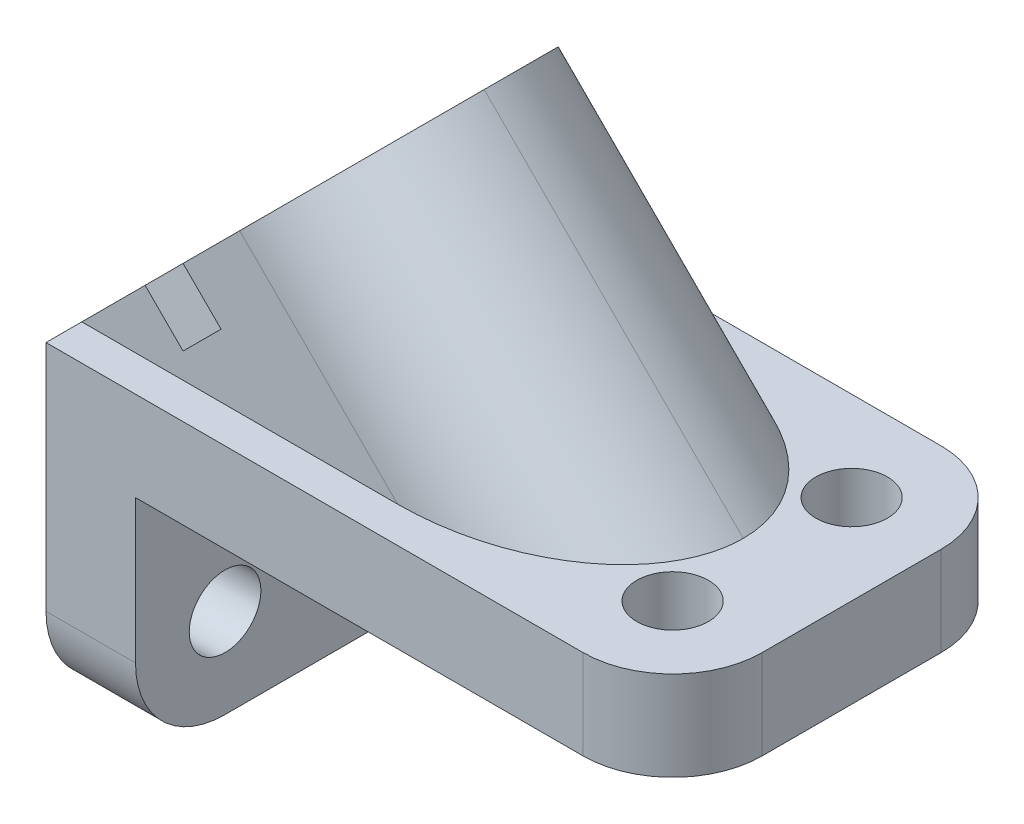
ISO-10303-21;
HEADER;
FILE_DESCRIPTION(('STEP AP214'),'2;1');
FILE_NAME('part.step','',(''),(''),'','','');
FILE_SCHEMA(('AUTOMOTIVE_DESIGN { 1 0 10303 214 1 1 1 1 }'));
ENDSEC;
DATA;
#1=APPLICATION_CONTEXT('core data for automotive mechanical design processes');
#2=APPLICATION_PROTOCOL_DEFINITION('international standard','automotive_design',2000,#1);
#3=PRODUCT_CONTEXT('',#1,'mechanical');
#4=PRODUCT('Part','Part','',(#3));
#5=PRODUCT_RELATED_PRODUCT_CATEGORY('part','',(#4));
#6=PRODUCT_DEFINITION_FORMATION('','',#4);
#7=PRODUCT_DEFINITION_CONTEXT('part definition',#1,'design');
#8=PRODUCT_DEFINITION('design','',#6,#7);
#9=PRODUCT_DEFINITION_SHAPE('','',#8);
#10=(LENGTH_UNIT() NAMED_UNIT(*) SI_UNIT(.MILLI.,.METRE.));
#11=(NAMED_UNIT(*) PLANE_ANGLE_UNIT() SI_UNIT($,.RADIAN.));
#12=(NAMED_UNIT(*) SI_UNIT($,.STERADIAN.) SOLID_ANGLE_UNIT());
#13=UNCERTAINTY_MEASURE_WITH_UNIT(LENGTH_MEASURE(1.E-05),#10,'distance_accuracy_value','');
#14=(GEOMETRIC_REPRESENTATION_CONTEXT(3) GLOBAL_UNCERTAINTY_ASSIGNED_CONTEXT((#13)) GLOBAL_UNIT_ASSIGNED_CONTEXT((#10,
#11,#12)) REPRESENTATION_CONTEXT('',''));
#15=CARTESIAN_POINT('',(0.,0.,0.));
#16=DIRECTION('',(0.,0.,1.));
#17=DIRECTION('',(1.,0.,0.));
#18=AXIS2_PLACEMENT_3D('',#15,#16,#17);
#19=CARTESIAN_POINT('',(-62.4999999999995,62.5000000000001,0.));
#20=DIRECTION('',(0.707106781186544,-0.707106781186551,0.));
#21=DIRECTION('',(0.707106781186551,0.707106781186544,0.));
#22=AXIS2_PLACEMENT_3D('',#19,#20,#21);
#23=PLANE('',#22);
#24=DIRECTION('',(0.,0.,1.));
#25=VECTOR('',#24,1.);
#26=CARTESIAN_POINT('',(-82.3223304703363,42.6776695296637,-40.));
#27=LINE('',#26,#25);
#28=CARTESIAN_POINT('',(-82.3223304703363,42.6776695296637,-40.));
#29=VERTEX_POINT('',#28);
#30=CARTESIAN_POINT('',(-82.3223304703363,42.6776695296636,39.9999999999999));
#31=VERTEX_POINT('',#30);
#32=EDGE_CURVE('E283',#29,#31,#27,.T.);
#33=ORIENTED_EDGE('',*,*,#32,.F.);
#34=DIRECTION('',(0.707106781186551,0.707106781186544,0.));
#35=VECTOR('',#34,1.);
#36=CARTESIAN_POINT('',(-27.6217076664877,97.3782923335116,-40.));
#37=LINE('',#36,#35);
#38=CARTESIAN_POINT('',(-100.,25.,-40.));
#39=VERTEX_POINT('',#38);
#40=EDGE_CURVE('E187',#39,#29,#37,.T.);
#41=ORIENTED_EDGE('',*,*,#40,.F.);
#42=DIRECTION('',(0.,0.,-1.));
#43=VECTOR('',#42,1.);
#44=CARTESIAN_POINT('',(-100.,25.,40.));
#45=LINE('',#44,#43);
#46=CARTESIAN_POINT('',(-100.,25.,40.));
#47=VERTEX_POINT('',#46);
#48=EDGE_CURVE('E193',#47,#39,#45,.T.);
#49=ORIENTED_EDGE('',*,*,#48,.F.);
#50=DIRECTION('',(-0.707106781186551,-0.707106781186544,0.));
#51=VECTOR('',#50,1.);
#52=CARTESIAN_POINT('',(-27.6217076664877,97.3782923335116,40.));
#53=LINE('',#52,#51);
#54=EDGE_CURVE('E204',#31,#47,#53,.T.);
#55=ORIENTED_EDGE('',*,*,#54,.F.);
#56=EDGE_LOOP('',(#33,#41,#49,#55));
#57=FACE_BOUND('',#56,.T.);
#58=ADVANCED_FACE('F39',(#57),#23,.F.);
#59=CARTESIAN_POINT('',(-46.9669914110087,78.0330085889908,0.));
#60=DIRECTION('',(-0.707106781186544,0.707106781186551,0.));
#61=DIRECTION('',(-0.707106781186551,-0.707106781186544,0.));
#62=AXIS2_PLACEMENT_3D('',#59,#60,#61);
#63=CIRCLE('',#62,15.);
#64=CARTESIAN_POINT('',(-57.573593128807,67.4264068711927,0.));
#65=VERTEX_POINT('',#64);
#66=EDGE_CURVE('E289',#65,#65,#63,.T.);
#67=ORIENTED_EDGE('',*,*,#66,.F.);
#68=EDGE_LOOP('',(#67));
#69=FACE_BOUND('',#68,.T.);
#70=CARTESIAN_POINT('',(-55.9059789139498,69.0940210860498,0.));
#71=DIRECTION('',(0.707106781186544,-0.707106781186551,0.));
#72=DIRECTION('',(0.707106781186551,0.707106781186544,0.));
#73=AXIS2_PLACEMENT_3D('',#70,#71,#72);
#74=CIRCLE('',#73,40.);
#75=CARTESIAN_POINT('',(-55.9059789139497,69.0940210860498,40.));
#76=VERTEX_POINT('',#75);
#77=CARTESIAN_POINT('',(-27.6217076664877,97.3782923335116,0.));
#78=VERTEX_POINT('',#77);
#79=EDGE_CURVE('E282',#76,#78,#74,.F.);
#80=ORIENTED_EDGE('',*,*,#79,.T.);
#81=CARTESIAN_POINT('',(-55.9059789139498,69.0940210860498,0.));
#82=DIRECTION('',(0.707106781186544,-0.707106781186551,0.));
#83=DIRECTION('',(0.707106781186551,0.707106781186544,0.));
#84=AXIS2_PLACEMENT_3D('',#81,#82,#83);
#85=CIRCLE('',#84,40.);
#86=CARTESIAN_POINT('',(-55.9059789139498,69.0940210860498,-40.));
#87=VERTEX_POINT('',#86);
#88=EDGE_CURVE('E290',#78,#87,#85,.F.);
#89=ORIENTED_EDGE('',*,*,#88,.T.);
#90=CARTESIAN_POINT('',(-71.715728752538,53.2842712474618,-40.));
#91=VERTEX_POINT('',#90);
#92=EDGE_CURVE('E198',#91,#87,#37,.T.);
#93=ORIENTED_EDGE('',*,*,#92,.F.);
#94=DIRECTION('',(0.,0.,-1.));
#95=VECTOR('',#94,1.);
#96=CARTESIAN_POINT('',(-71.715728752538,53.2842712474618,-40.));
#97=LINE('',#96,#95);
#98=CARTESIAN_POINT('',(-71.715728752538,53.2842712474618,40.));
#99=VERTEX_POINT('',#98);
#100=EDGE_CURVE('E179',#99,#91,#97,.T.);
#101=ORIENTED_EDGE('',*,*,#100,.F.);
#102=EDGE_CURVE('E200',#76,#99,#53,.T.);
#103=ORIENTED_EDGE('',*,*,#102,.F.);
#104=EDGE_LOOP('',(#80,#89,#93,#101,#103));
#105=FACE_BOUND('',#104,.T.);
#106=ADVANCED_FACE('F304',(#69,#105),#23,.F.);
#107=CARTESIAN_POINT('',(75.,25.,-50.));
#108=DIRECTION('',(-1.,0.,0.));
#109=DIRECTION('',(0.,0.,1.));
#110=AXIS2_PLACEMENT_3D('',#107,#108,#109);
#111=PLANE('',#110);
#112=DIRECTION('',(0.,0.,-1.));
#113=VECTOR('',#112,1.);
#114=CARTESIAN_POINT('',(75.,0.,-50.));
#115=LINE('',#114,#113);
#116=CARTESIAN_POINT('',(75.,0.,25.));
#117=VERTEX_POINT('',#116);
#118=CARTESIAN_POINT('',(75.,0.,-25.));
#119=VERTEX_POINT('',#118);
#120=EDGE_CURVE('E216',#117,#119,#115,.T.);
#121=ORIENTED_EDGE('',*,*,#120,.T.);
#122=DIRECTION('',(0.,-1.,0.));
#123=VECTOR('',#122,1.);
#124=CARTESIAN_POINT('',(75.,25.,-25.));
#125=LINE('',#124,#123);
#126=CARTESIAN_POINT('',(75.,25.,-25.));
#127=VERTEX_POINT('',#126);
#128=EDGE_CURVE('E273',#119,#127,#125,.F.);
#129=ORIENTED_EDGE('',*,*,#128,.T.);
#130=DIRECTION('',(0.,0.,-1.));
#131=VECTOR('',#130,1.);
#132=CARTESIAN_POINT('',(75.,25.,-50.));
#133=LINE('',#132,#131);
#134=CARTESIAN_POINT('',(75.,25.,25.));
#135=VERTEX_POINT('',#134);
#136=EDGE_CURVE('E228',#135,#127,#133,.T.);
#137=ORIENTED_EDGE('',*,*,#136,.F.);
#138=DIRECTION('',(0.,-1.,0.));
#139=VECTOR('',#138,1.);
#140=CARTESIAN_POINT('',(75.,25.,25.));
#141=LINE('',#140,#139);
#142=EDGE_CURVE('E275',#135,#117,#141,.T.);
#143=ORIENTED_EDGE('',*,*,#142,.T.);
#144=EDGE_LOOP('',(#121,#129,#137,#143));
#145=FACE_BOUND('',#144,.T.);
#146=ADVANCED_FACE('F407',(#145),#111,.F.);
#147=CARTESIAN_POINT('',(-75.,25.,-50.));
#148=DIRECTION('',(0.,0.,1.));
#149=DIRECTION('',(1.,0.,0.));
#150=AXIS2_PLACEMENT_3D('',#147,#148,#149);
#151=PLANE('',#150);
#152=DIRECTION('',(0.,-1.,0.));
#153=VECTOR('',#152,1.);
#154=CARTESIAN_POINT('',(-75.,25.,-50.));
#155=LINE('',#154,#153);
#156=CARTESIAN_POINT('',(-75.,0.,-50.));
#157=VERTEX_POINT('',#156);
#158=CARTESIAN_POINT('',(-75.,-40.,-50.));
#159=VERTEX_POINT('',#158);
#160=EDGE_CURVE('E197',#157,#159,#155,.T.);
#161=ORIENTED_EDGE('',*,*,#160,.T.);
#162=DIRECTION('',(1.,0.,0.));
#163=VECTOR('',#162,1.);
#164=CARTESIAN_POINT('',(-75.,-40.,-50.));
#165=LINE('',#164,#163);
#166=CARTESIAN_POINT('',(-100.,-40.,-50.));
#167=VERTEX_POINT('',#166);
#168=EDGE_CURVE('E260',#159,#167,#165,.F.);
#169=ORIENTED_EDGE('',*,*,#168,.T.);
#170=DIRECTION('',(0.,-1.,0.));
#171=VECTOR('',#170,1.);
#172=CARTESIAN_POINT('',(-100.,25.,-50.));
#173=LINE('',#172,#171);
#174=CARTESIAN_POINT('',(-100.,25.,-50.));
#175=VERTEX_POINT('',#174);
#176=EDGE_CURVE('E207',#175,#167,#173,.T.);
#177=ORIENTED_EDGE('',*,*,#176,.F.);
#178=DIRECTION('',(-1.,0.,0.));
#179=VECTOR('',#178,1.);
#180=CARTESIAN_POINT('',(-75.,25.,-50.));
#181=LINE('',#180,#179);
#182=CARTESIAN_POINT('',(50.,25.,-50.));
#183=VERTEX_POINT('',#182);
#184=EDGE_CURVE('E230',#183,#175,#181,.T.);
#185=ORIENTED_EDGE('',*,*,#184,.F.);
#186=DIRECTION('',(0.,-1.,0.));
#187=VECTOR('',#186,1.);
#188=CARTESIAN_POINT('',(50.,25.,-50.));
#189=LINE('',#188,#187);
#190=CARTESIAN_POINT('',(50.,0.,-50.));
#191=VERTEX_POINT('',#190);
#192=EDGE_CURVE('E251',#183,#191,#189,.T.);
#193=ORIENTED_EDGE('',*,*,#192,.T.);
#194=DIRECTION('',(-1.,0.,0.));
#195=VECTOR('',#194,1.);
#196=CARTESIAN_POINT('',(-75.,0.,-50.));
#197=LINE('',#196,#195);
#198=EDGE_CURVE('E237',#191,#157,#197,.T.);
#199=ORIENTED_EDGE('',*,*,#198,.T.);
#200=EDGE_LOOP('',(#161,#169,#177,#185,#193,#199));
#201=FACE_BOUND('',#200,.T.);
#202=ADVANCED_FACE('F425',(#201),#151,.F.);
#203=CARTESIAN_POINT('',(-75.,25.,50.));
#204=DIRECTION('',(0.,0.,-1.));
#205=DIRECTION('',(-1.,0.,0.));
#206=AXIS2_PLACEMENT_3D('',#203,#204,#205);
#207=PLANE('',#206);
#208=DIRECTION('',(0.,1.,0.));
#209=VECTOR('',#208,1.);
#210=CARTESIAN_POINT('',(-100.,25.,50.));
#211=LINE('',#210,#209);
#212=CARTESIAN_POINT('',(-100.,-40.,50.));
#213=VERTEX_POINT('',#212);
#214=CARTESIAN_POINT('',(-100.,25.,50.));
#215=VERTEX_POINT('',#214);
#216=EDGE_CURVE('E213',#213,#215,#211,.T.);
#217=ORIENTED_EDGE('',*,*,#216,.F.);
#218=DIRECTION('',(1.,0.,0.));
#219=VECTOR('',#218,1.);
#220=CARTESIAN_POINT('',(-75.,-40.,50.));
#221=LINE('',#220,#219);
#222=CARTESIAN_POINT('',(-75.,-40.,50.));
#223=VERTEX_POINT('',#222);
#224=EDGE_CURVE('E263',#213,#223,#221,.T.);
#225=ORIENTED_EDGE('',*,*,#224,.T.);
#226=DIRECTION('',(0.,1.,0.));
#227=VECTOR('',#226,1.);
#228=CARTESIAN_POINT('',(-75.,25.,50.));
#229=LINE('',#228,#227);
#230=CARTESIAN_POINT('',(-75.,0.,50.));
#231=VERTEX_POINT('',#230);
#232=EDGE_CURVE('E208',#223,#231,#229,.T.);
#233=ORIENTED_EDGE('',*,*,#232,.T.);
#234=DIRECTION('',(1.,0.,0.));
#235=VECTOR('',#234,1.);
#236=CARTESIAN_POINT('',(-75.,0.,50.));
#237=LINE('',#236,#235);
#238=CARTESIAN_POINT('',(50.,0.,50.));
#239=VERTEX_POINT('',#238);
#240=EDGE_CURVE('E229',#231,#239,#237,.T.);
#241=ORIENTED_EDGE('',*,*,#240,.T.);
#242=DIRECTION('',(0.,-1.,0.));
#243=VECTOR('',#242,1.);
#244=CARTESIAN_POINT('',(50.,25.,50.));
#245=LINE('',#244,#243);
#246=CARTESIAN_POINT('',(50.,25.,50.));
#247=VERTEX_POINT('',#246);
#248=EDGE_CURVE('E265',#239,#247,#245,.F.);
#249=ORIENTED_EDGE('',*,*,#248,.T.);
#250=DIRECTION('',(1.,0.,0.));
#251=VECTOR('',#250,1.);
#252=CARTESIAN_POINT('',(-75.,25.,50.));
#253=LINE('',#252,#251);
#254=EDGE_CURVE('E231',#215,#247,#253,.T.);
#255=ORIENTED_EDGE('',*,*,#254,.F.);
#256=EDGE_LOOP('',(#217,#225,#233,#241,#249,#255));
#257=FACE_BOUND('',#256,.T.);
#258=ADVANCED_FACE('F379',(#257),#207,.F.);
#259=CARTESIAN_POINT('',(0.,25.,0.));
#260=DIRECTION('',(0.,1.,0.));
#261=DIRECTION('',(0.,0.,1.));
#262=AXIS2_PLACEMENT_3D('',#259,#260,#261);
#263=PLANE('',#262);
#264=CARTESIAN_POINT('',(50.,25.,25.));
#265=DIRECTION('',(0.,1.,0.));
#266=DIRECTION('',(0.,0.,1.));
#267=AXIS2_PLACEMENT_3D('',#264,#265,#266);
#268=CIRCLE('',#267,10.);
#269=CARTESIAN_POINT('',(50.,25.,35.));
#270=VERTEX_POINT('',#269);
#271=EDGE_CURVE('E328',#270,#270,#268,.T.);
#272=ORIENTED_EDGE('',*,*,#271,.F.);
#273=EDGE_LOOP('',(#272));
#274=FACE_BOUND('',#273,.T.);
#275=CARTESIAN_POINT('',(50.,25.,-25.));
#276=DIRECTION('',(0.,1.,0.));
#277=DIRECTION('',(0.,0.,1.));
#278=AXIS2_PLACEMENT_3D('',#275,#276,#277);
#279=CIRCLE('',#278,10.);
#280=CARTESIAN_POINT('',(50.,25.,-15.));
#281=VERTEX_POINT('',#280);
#282=EDGE_CURVE('E326',#281,#281,#279,.T.);
#283=ORIENTED_EDGE('',*,*,#282,.F.);
#284=EDGE_LOOP('',(#283));
#285=FACE_BOUND('',#284,.T.);
#286=DIRECTION('',(-1.,0.,0.));
#287=VECTOR('',#286,1.);
#288=CARTESIAN_POINT('',(72.3797065470738,25.,-40.0000000000001));
#289=LINE('',#288,#287);
#290=CARTESIAN_POINT('',(-11.8119578279004,25.,-40.));
#291=VERTEX_POINT('',#290);
#292=EDGE_CURVE('E205',#291,#39,#289,.T.);
#293=ORIENTED_EDGE('',*,*,#292,.F.);
#294=CARTESIAN_POINT('',(-11.8119578279004,25.,0.));
#295=DIRECTION('',(0.,1.,0.));
#296=DIRECTION('',(-1.,0.,0.));
#297=AXIS2_PLACEMENT_3D('',#294,#295,#296);
#298=ELLIPSE('',#297,56.5685424949235,40.);
#299=CARTESIAN_POINT('',(44.7565846670231,25.,0.));
#300=VERTEX_POINT('',#299);
#301=EDGE_CURVE('E48',#291,#300,#298,.F.);
#302=ORIENTED_EDGE('',*,*,#301,.T.);
#303=CARTESIAN_POINT('',(-11.8119578279004,25.,0.));
#304=DIRECTION('',(0.,1.,0.));
#305=DIRECTION('',(-1.,0.,0.));
#306=AXIS2_PLACEMENT_3D('',#303,#304,#305);
#307=ELLIPSE('',#306,56.5685424949235,40.);
#308=CARTESIAN_POINT('',(-11.8119578279004,25.,40.));
#309=VERTEX_POINT('',#308);
#310=EDGE_CURVE('E11',#300,#309,#307,.F.);
#311=ORIENTED_EDGE('',*,*,#310,.T.);
#312=DIRECTION('',(1.,0.,0.));
#313=VECTOR('',#312,1.);
#314=CARTESIAN_POINT('',(72.3797065470738,25.,39.9999999999999));
#315=LINE('',#314,#313);
#316=EDGE_CURVE('E199',#47,#309,#315,.T.);
#317=ORIENTED_EDGE('',*,*,#316,.F.);
#318=DIRECTION('',(0.,0.,-1.));
#319=VECTOR('',#318,1.);
#320=CARTESIAN_POINT('',(-100.,25.,-50.));
#321=LINE('',#320,#319);
#322=EDGE_CURVE('E217',#215,#47,#321,.T.);
#323=ORIENTED_EDGE('',*,*,#322,.F.);
#324=ORIENTED_EDGE('',*,*,#254,.T.);
#325=CARTESIAN_POINT('',(50.,25.,25.));
#326=DIRECTION('',(0.,1.,0.));
#327=DIRECTION('',(0.,0.,1.));
#328=AXIS2_PLACEMENT_3D('',#325,#326,#327);
#329=CIRCLE('',#328,25.);
#330=EDGE_CURVE('E280',#247,#135,#329,.T.);
#331=ORIENTED_EDGE('',*,*,#330,.T.);
#332=ORIENTED_EDGE('',*,*,#136,.T.);
#333=CARTESIAN_POINT('',(50.,25.,-25.));
#334=DIRECTION('',(0.,1.,0.));
#335=DIRECTION('',(0.,0.,1.));
#336=AXIS2_PLACEMENT_3D('',#333,#334,#335);
#337=CIRCLE('',#336,25.);
#338=EDGE_CURVE('E279',#127,#183,#337,.T.);
#339=ORIENTED_EDGE('',*,*,#338,.T.);
#340=ORIENTED_EDGE('',*,*,#184,.T.);
#341=EDGE_CURVE('E211',#39,#175,#321,.T.);
#342=ORIENTED_EDGE('',*,*,#341,.F.);
#343=EDGE_LOOP('',(#293,#302,#311,#317,#323,#324,#331,#332,#339,#340,#342));
#344=FACE_BOUND('',#343,.T.);
#345=ADVANCED_FACE('F413',(#274,#285,#344),#263,.T.);
#346=CARTESIAN_POINT('',(0.,0.,0.));
#347=DIRECTION('',(0.,1.,0.));
#348=DIRECTION('',(0.,0.,1.));
#349=AXIS2_PLACEMENT_3D('',#346,#347,#348);
#350=PLANE('',#349);
#351=CARTESIAN_POINT('',(50.,0.,-25.));
#352=DIRECTION('',(0.,1.,0.));
#353=DIRECTION('',(0.,0.,1.));
#354=AXIS2_PLACEMENT_3D('',#351,#352,#353);
#355=CIRCLE('',#354,10.);
#356=CARTESIAN_POINT('',(50.,0.,-15.));
#357=VERTEX_POINT('',#356);
#358=EDGE_CURVE('E323',#357,#357,#355,.T.);
#359=ORIENTED_EDGE('',*,*,#358,.T.);
#360=EDGE_LOOP('',(#359));
#361=FACE_BOUND('',#360,.T.);
#362=CARTESIAN_POINT('',(50.,0.,25.));
#363=DIRECTION('',(0.,1.,0.));
#364=DIRECTION('',(0.,0.,1.));
#365=AXIS2_PLACEMENT_3D('',#362,#363,#364);
#366=CIRCLE('',#365,10.);
#367=CARTESIAN_POINT('',(50.,0.,35.));
#368=VERTEX_POINT('',#367);
#369=EDGE_CURVE('E327',#368,#368,#366,.T.);
#370=ORIENTED_EDGE('',*,*,#369,.T.);
#371=EDGE_LOOP('',(#370));
#372=FACE_BOUND('',#371,.T.);
#373=CARTESIAN_POINT('',(31.0660171779813,0.,0.));
#374=DIRECTION('',(0.,1.,0.));
#375=DIRECTION('',(-1.,0.,0.));
#376=AXIS2_PLACEMENT_3D('',#373,#374,#375);
#377=ELLIPSE('',#376,21.2132034355963,15.);
#378=CARTESIAN_POINT('',(9.85281374238499,0.,0.));
#379=VERTEX_POINT('',#378);
#380=EDGE_CURVE('E284',#379,#379,#377,.T.);
#381=ORIENTED_EDGE('',*,*,#380,.T.);
#382=EDGE_LOOP('',(#381));
#383=FACE_BOUND('',#382,.T.);
#384=ORIENTED_EDGE('',*,*,#198,.F.);
#385=CARTESIAN_POINT('',(50.,0.,-25.));
#386=DIRECTION('',(0.,1.,0.));
#387=DIRECTION('',(0.,0.,1.));
#388=AXIS2_PLACEMENT_3D('',#385,#386,#387);
#389=CIRCLE('',#388,25.);
#390=EDGE_CURVE('E267',#191,#119,#389,.F.);
#391=ORIENTED_EDGE('',*,*,#390,.T.);
#392=ORIENTED_EDGE('',*,*,#120,.F.);
#393=CARTESIAN_POINT('',(50.,0.,25.));
#394=DIRECTION('',(0.,1.,0.));
#395=DIRECTION('',(0.,0.,1.));
#396=AXIS2_PLACEMENT_3D('',#393,#394,#395);
#397=CIRCLE('',#396,25.);
#398=EDGE_CURVE('E270',#117,#239,#397,.F.);
#399=ORIENTED_EDGE('',*,*,#398,.T.);
#400=ORIENTED_EDGE('',*,*,#240,.F.);
#401=DIRECTION('',(0.,0.,1.));
#402=VECTOR('',#401,1.);
#403=CARTESIAN_POINT('',(-75.,0.,-50.));
#404=LINE('',#403,#402);
#405=EDGE_CURVE('E241',#157,#231,#404,.T.);
#406=ORIENTED_EDGE('',*,*,#405,.F.);
#407=EDGE_LOOP('',(#384,#391,#392,#399,#400,#406));
#408=FACE_BOUND('',#407,.T.);
#409=ADVANCED_FACE('F412',(#361,#372,#383,#408),#350,.F.);
#410=CARTESIAN_POINT('',(-75.,0.,0.));
#411=DIRECTION('',(-1.,0.,0.));
#412=DIRECTION('',(0.,0.,1.));
#413=AXIS2_PLACEMENT_3D('',#410,#411,#412);
#414=PLANE('',#413);
#415=CARTESIAN_POINT('',(-75.,-40.,-25.));
#416=DIRECTION('',(-1.,0.,0.));
#417=DIRECTION('',(0.,0.,1.));
#418=AXIS2_PLACEMENT_3D('',#415,#416,#417);
#419=CIRCLE('',#418,10.);
#420=CARTESIAN_POINT('',(-75.,-40.,-15.));
#421=VERTEX_POINT('',#420);
#422=EDGE_CURVE('E335',#421,#421,#419,.T.);
#423=ORIENTED_EDGE('',*,*,#422,.T.);
#424=EDGE_LOOP('',(#423));
#425=FACE_BOUND('',#424,.T.);
#426=CARTESIAN_POINT('',(-75.,-40.,25.));
#427=DIRECTION('',(-1.,0.,0.));
#428=DIRECTION('',(0.,0.,1.));
#429=AXIS2_PLACEMENT_3D('',#426,#427,#428);
#430=CIRCLE('',#429,10.);
#431=CARTESIAN_POINT('',(-75.,-40.,35.));
#432=VERTEX_POINT('',#431);
#433=EDGE_CURVE('E336',#432,#432,#430,.T.);
#434=ORIENTED_EDGE('',*,*,#433,.T.);
#435=EDGE_LOOP('',(#434));
#436=FACE_BOUND('',#435,.T.);
#437=DIRECTION('',(0.,0.,1.));
#438=VECTOR('',#437,1.);
#439=CARTESIAN_POINT('',(-75.,-65.,-50.));
#440=LINE('',#439,#438);
#441=CARTESIAN_POINT('',(-75.,-65.,-25.));
#442=VERTEX_POINT('',#441);
#443=CARTESIAN_POINT('',(-75.,-65.,25.));
#444=VERTEX_POINT('',#443);
#445=EDGE_CURVE('E221',#442,#444,#440,.T.);
#446=ORIENTED_EDGE('',*,*,#445,.F.);
#447=CARTESIAN_POINT('',(-75.,-40.,-25.));
#448=DIRECTION('',(-1.,0.,0.));
#449=DIRECTION('',(0.,0.,1.));
#450=AXIS2_PLACEMENT_3D('',#447,#448,#449);
#451=CIRCLE('',#450,25.);
#452=EDGE_CURVE('E255',#442,#159,#451,.F.);
#453=ORIENTED_EDGE('',*,*,#452,.T.);
#454=ORIENTED_EDGE('',*,*,#160,.F.);
#455=ORIENTED_EDGE('',*,*,#405,.T.);
#456=ORIENTED_EDGE('',*,*,#232,.F.);
#457=CARTESIAN_POINT('',(-75.,-40.,25.));
#458=DIRECTION('',(-1.,0.,0.));
#459=DIRECTION('',(0.,0.,1.));
#460=AXIS2_PLACEMENT_3D('',#457,#458,#459);
#461=CIRCLE('',#460,25.);
#462=EDGE_CURVE('E249',#223,#444,#461,.F.);
#463=ORIENTED_EDGE('',*,*,#462,.T.);
#464=EDGE_LOOP('',(#446,#453,#454,#455,#456,#463));
#465=FACE_BOUND('',#464,.T.);
#466=ADVANCED_FACE('F371',(#425,#436,#465),#414,.F.);
#467=CARTESIAN_POINT('',(-100.,-65.,-50.));
#468=DIRECTION('',(0.,1.,0.));
#469=DIRECTION('',(0.,0.,1.));
#470=AXIS2_PLACEMENT_3D('',#467,#468,#469);
#471=PLANE('',#470);
#472=DIRECTION('',(0.,0.,1.));
#473=VECTOR('',#472,1.);
#474=CARTESIAN_POINT('',(-100.,-65.,-50.));
#475=LINE('',#474,#473);
#476=CARTESIAN_POINT('',(-100.,-65.,-25.));
#477=VERTEX_POINT('',#476);
#478=CARTESIAN_POINT('',(-100.,-65.,25.));
#479=VERTEX_POINT('',#478);
#480=EDGE_CURVE('E209',#477,#479,#475,.T.);
#481=ORIENTED_EDGE('',*,*,#480,.F.);
#482=DIRECTION('',(1.,0.,0.));
#483=VECTOR('',#482,1.);
#484=CARTESIAN_POINT('',(-100.,-65.,-25.));
#485=LINE('',#484,#483);
#486=EDGE_CURVE('E250',#477,#442,#485,.T.);
#487=ORIENTED_EDGE('',*,*,#486,.T.);
#488=ORIENTED_EDGE('',*,*,#445,.T.);
#489=DIRECTION('',(1.,0.,0.));
#490=VECTOR('',#489,1.);
#491=CARTESIAN_POINT('',(-100.,-65.,25.));
#492=LINE('',#491,#490);
#493=EDGE_CURVE('E236',#444,#479,#492,.F.);
#494=ORIENTED_EDGE('',*,*,#493,.T.);
#495=EDGE_LOOP('',(#481,#487,#488,#494));
#496=FACE_BOUND('',#495,.T.);
#497=ADVANCED_FACE('F353',(#496),#471,.F.);
#498=CARTESIAN_POINT('',(-100.,0.,0.));
#499=DIRECTION('',(-1.,0.,0.));
#500=DIRECTION('',(0.,0.,1.));
#501=AXIS2_PLACEMENT_3D('',#498,#499,#500);
#502=PLANE('',#501);
#503=CARTESIAN_POINT('',(-100.,-40.,-25.));
#504=DIRECTION('',(-1.,0.,0.));
#505=DIRECTION('',(0.,0.,1.));
#506=AXIS2_PLACEMENT_3D('',#503,#504,#505);
#507=CIRCLE('',#506,10.);
#508=CARTESIAN_POINT('',(-100.,-40.,-15.));
#509=VERTEX_POINT('',#508);
#510=EDGE_CURVE('E342',#509,#509,#507,.T.);
#511=ORIENTED_EDGE('',*,*,#510,.F.);
#512=EDGE_LOOP('',(#511));
#513=FACE_BOUND('',#512,.T.);
#514=CARTESIAN_POINT('',(-100.,-40.,25.));
#515=DIRECTION('',(-1.,0.,0.));
#516=DIRECTION('',(0.,0.,1.));
#517=AXIS2_PLACEMENT_3D('',#514,#515,#516);
#518=CIRCLE('',#517,10.);
#519=CARTESIAN_POINT('',(-100.,-40.,35.));
#520=VERTEX_POINT('',#519);
#521=EDGE_CURVE('E311',#520,#520,#518,.T.);
#522=ORIENTED_EDGE('',*,*,#521,.F.);
#523=EDGE_LOOP('',(#522));
#524=FACE_BOUND('',#523,.T.);
#525=ORIENTED_EDGE('',*,*,#176,.T.);
#526=CARTESIAN_POINT('',(-100.,-40.,-25.));
#527=DIRECTION('',(-1.,0.,0.));
#528=DIRECTION('',(0.,0.,1.));
#529=AXIS2_PLACEMENT_3D('',#526,#527,#528);
#530=CIRCLE('',#529,25.);
#531=EDGE_CURVE('E262',#167,#477,#530,.T.);
#532=ORIENTED_EDGE('',*,*,#531,.T.);
#533=ORIENTED_EDGE('',*,*,#480,.T.);
#534=CARTESIAN_POINT('',(-100.,-40.,25.));
#535=DIRECTION('',(-1.,0.,0.));
#536=DIRECTION('',(0.,0.,1.));
#537=AXIS2_PLACEMENT_3D('',#534,#535,#536);
#538=CIRCLE('',#537,25.);
#539=EDGE_CURVE('E259',#479,#213,#538,.T.);
#540=ORIENTED_EDGE('',*,*,#539,.T.);
#541=ORIENTED_EDGE('',*,*,#216,.T.);
#542=ORIENTED_EDGE('',*,*,#322,.T.);
#543=ORIENTED_EDGE('',*,*,#48,.T.);
#544=ORIENTED_EDGE('',*,*,#341,.T.);
#545=EDGE_LOOP('',(#525,#532,#533,#540,#541,#542,#543,#544));
#546=FACE_BOUND('',#545,.T.);
#547=ADVANCED_FACE('F348',(#513,#524,#546),#502,.T.);
#548=CARTESIAN_POINT('',(-100.,-40.,-25.));
#549=DIRECTION('',(1.,0.,0.));
#550=DIRECTION('',(0.,0.,-1.));
#551=AXIS2_PLACEMENT_3D('',#548,#549,#550);
#552=CYLINDRICAL_SURFACE('',#551,25.);
#553=ORIENTED_EDGE('',*,*,#531,.F.);
#554=ORIENTED_EDGE('',*,*,#168,.F.);
#555=ORIENTED_EDGE('',*,*,#452,.F.);
#556=ORIENTED_EDGE('',*,*,#486,.F.);
#557=EDGE_LOOP('',(#553,#554,#555,#556));
#558=FACE_BOUND('',#557,.T.);
#559=ADVANCED_FACE('F355',(#558),#552,.T.);
#560=CARTESIAN_POINT('',(-75.,-40.,25.));
#561=DIRECTION('',(1.,0.,0.));
#562=DIRECTION('',(0.,0.,-1.));
#563=AXIS2_PLACEMENT_3D('',#560,#561,#562);
#564=CYLINDRICAL_SURFACE('',#563,25.);
#565=ORIENTED_EDGE('',*,*,#539,.F.);
#566=ORIENTED_EDGE('',*,*,#493,.F.);
#567=ORIENTED_EDGE('',*,*,#462,.F.);
#568=ORIENTED_EDGE('',*,*,#224,.F.);
#569=EDGE_LOOP('',(#565,#566,#567,#568));
#570=FACE_BOUND('',#569,.T.);
#571=ADVANCED_FACE('F380',(#570),#564,.T.);
#572=CARTESIAN_POINT('',(50.,25.,-25.));
#573=DIRECTION('',(0.,-1.,0.));
#574=DIRECTION('',(0.,0.,-1.));
#575=AXIS2_PLACEMENT_3D('',#572,#573,#574);
#576=CYLINDRICAL_SURFACE('',#575,25.);
#577=ORIENTED_EDGE('',*,*,#338,.F.);
#578=ORIENTED_EDGE('',*,*,#128,.F.);
#579=ORIENTED_EDGE('',*,*,#390,.F.);
#580=ORIENTED_EDGE('',*,*,#192,.F.);
#581=EDGE_LOOP('',(#577,#578,#579,#580));
#582=FACE_BOUND('',#581,.T.);
#583=ADVANCED_FACE('F432',(#582),#576,.T.);
#584=CARTESIAN_POINT('',(50.,25.,25.));
#585=DIRECTION('',(0.,-1.,0.));
#586=DIRECTION('',(0.,0.,-1.));
#587=AXIS2_PLACEMENT_3D('',#584,#585,#586);
#588=CYLINDRICAL_SURFACE('',#587,25.);
#589=ORIENTED_EDGE('',*,*,#330,.F.);
#590=ORIENTED_EDGE('',*,*,#248,.F.);
#591=ORIENTED_EDGE('',*,*,#398,.F.);
#592=ORIENTED_EDGE('',*,*,#142,.F.);
#593=EDGE_LOOP('',(#589,#590,#591,#592));
#594=FACE_BOUND('',#593,.T.);
#595=ADVANCED_FACE('F396',(#594),#588,.T.);
#596=CARTESIAN_POINT('',(72.3797065470738,-2.62312188005094,-40.0000000000001));
#597=DIRECTION('',(0.,0.,1.));
#598=DIRECTION('',(1.,0.,0.));
#599=AXIS2_PLACEMENT_3D('',#596,#597,#598);
#600=PLANE('',#599);
#601=ORIENTED_EDGE('',*,*,#92,.T.);
#602=DIRECTION('',(-0.707106781186544,0.707106781186551,0.));
#603=VECTOR('',#602,1.);
#604=CARTESIAN_POINT('',(44.0954352996117,-30.9073931275127,-40.0000000000001));
#605=LINE('',#604,#603);
#606=EDGE_CURVE('E287',#87,#291,#605,.F.);
#607=ORIENTED_EDGE('',*,*,#606,.T.);
#608=ORIENTED_EDGE('',*,*,#292,.T.);
#609=ORIENTED_EDGE('',*,*,#40,.T.);
#610=DIRECTION('',(-0.707106781186544,0.707106781186551,0.));
#611=VECTOR('',#610,1.);
#612=CARTESIAN_POINT('',(-71.7157287525381,32.0710678118654,-40.0000000000001));
#613=LINE('',#612,#611);
#614=CARTESIAN_POINT('',(-71.7157287525381,32.0710678118654,-40.0000000000001));
#615=VERTEX_POINT('',#614);
#616=EDGE_CURVE('E165',#615,#29,#613,.T.);
#617=ORIENTED_EDGE('',*,*,#616,.F.);
#618=DIRECTION('',(-0.707106781186551,-0.707106781186544,0.));
#619=VECTOR('',#618,1.);
#620=CARTESIAN_POINT('',(-61.1091270347398,42.6776695296636,-40.));
#621=LINE('',#620,#619);
#622=CARTESIAN_POINT('',(-61.1091270347398,42.6776695296636,-40.));
#623=VERTEX_POINT('',#622);
#624=EDGE_CURVE('E171',#623,#615,#621,.T.);
#625=ORIENTED_EDGE('',*,*,#624,.F.);
#626=DIRECTION('',(-0.707106781186544,0.707106781186551,0.));
#627=VECTOR('',#626,1.);
#628=CARTESIAN_POINT('',(-61.1091270347398,42.6776695296636,-40.));
#629=LINE('',#628,#627);
#630=EDGE_CURVE('E313',#623,#91,#629,.T.);
#631=ORIENTED_EDGE('',*,*,#630,.T.);
#632=EDGE_LOOP('',(#601,#607,#608,#609,#617,#625,#631));
#633=FACE_BOUND('',#632,.T.);
#634=ADVANCED_FACE('F183',(#633),#600,.F.);
#635=CARTESIAN_POINT('',(72.3797065470738,-2.62312188005093,39.9999999999999));
#636=DIRECTION('',(0.,0.,-1.));
#637=DIRECTION('',(-1.,0.,0.));
#638=AXIS2_PLACEMENT_3D('',#635,#636,#637);
#639=PLANE('',#638);
#640=ORIENTED_EDGE('',*,*,#316,.T.);
#641=DIRECTION('',(-0.707106781186544,0.707106781186551,0.));
#642=VECTOR('',#641,1.);
#643=CARTESIAN_POINT('',(44.0954352996117,-30.9073931275127,39.9999999999999));
#644=LINE('',#643,#642);
#645=EDGE_CURVE('E291',#309,#76,#644,.T.);
#646=ORIENTED_EDGE('',*,*,#645,.T.);
#647=ORIENTED_EDGE('',*,*,#102,.T.);
#648=DIRECTION('',(-0.707106781186544,0.707106781186551,0.));
#649=VECTOR('',#648,1.);
#650=CARTESIAN_POINT('',(-61.1091270347398,42.6776695296635,39.9999999999999));
#651=LINE('',#650,#649);
#652=CARTESIAN_POINT('',(-61.1091270347398,42.6776695296635,39.9999999999999));
#653=VERTEX_POINT('',#652);
#654=EDGE_CURVE('E189',#653,#99,#651,.T.);
#655=ORIENTED_EDGE('',*,*,#654,.F.);
#656=DIRECTION('',(0.707106781186551,0.707106781186544,0.));
#657=VECTOR('',#656,1.);
#658=CARTESIAN_POINT('',(-61.1091270347398,42.6776695296635,39.9999999999999));
#659=LINE('',#658,#657);
#660=CARTESIAN_POINT('',(-71.7157287525381,32.0710678118654,40.));
#661=VERTEX_POINT('',#660);
#662=EDGE_CURVE('E167',#661,#653,#659,.T.);
#663=ORIENTED_EDGE('',*,*,#662,.F.);
#664=DIRECTION('',(-0.707106781186544,0.707106781186551,0.));
#665=VECTOR('',#664,1.);
#666=CARTESIAN_POINT('',(-71.7157287525381,32.0710678118654,39.9999999999999));
#667=LINE('',#666,#665);
#668=EDGE_CURVE('E170',#661,#31,#667,.T.);
#669=ORIENTED_EDGE('',*,*,#668,.T.);
#670=ORIENTED_EDGE('',*,*,#54,.T.);
#671=EDGE_LOOP('',(#640,#646,#647,#655,#663,#669,#670));
#672=FACE_BOUND('',#671,.T.);
#673=ADVANCED_FACE('F296',(#672),#639,.F.);
#674=CARTESIAN_POINT('',(-61.1091270347398,42.6776695296636,-40.));
#675=DIRECTION('',(0.707106781186551,0.707106781186544,0.));
#676=DIRECTION('',(-0.707106781186544,0.707106781186551,0.));
#677=AXIS2_PLACEMENT_3D('',#674,#675,#676);
#678=PLANE('',#677);
#679=ORIENTED_EDGE('',*,*,#100,.T.);
#680=ORIENTED_EDGE('',*,*,#630,.F.);
#681=DIRECTION('',(0.,0.,-1.));
#682=VECTOR('',#681,1.);
#683=CARTESIAN_POINT('',(-61.1091270347398,42.6776695296636,-40.));
#684=LINE('',#683,#682);
#685=EDGE_CURVE('E180',#653,#623,#684,.T.);
#686=ORIENTED_EDGE('',*,*,#685,.F.);
#687=ORIENTED_EDGE('',*,*,#654,.T.);
#688=EDGE_LOOP('',(#679,#680,#686,#687));
#689=FACE_BOUND('',#688,.T.);
#690=ADVANCED_FACE('F390',(#689),#678,.F.);
#691=CARTESIAN_POINT('',(-71.7157287525381,32.0710678118654,-40.0000000000001));
#692=DIRECTION('',(-0.707106781186551,-0.707106781186544,0.));
#693=DIRECTION('',(0.707106781186544,-0.707106781186551,0.));
#694=AXIS2_PLACEMENT_3D('',#691,#692,#693);
#695=PLANE('',#694);
#696=ORIENTED_EDGE('',*,*,#32,.T.);
#697=ORIENTED_EDGE('',*,*,#668,.F.);
#698=DIRECTION('',(0.,0.,1.));
#699=VECTOR('',#698,1.);
#700=CARTESIAN_POINT('',(-71.7157287525381,32.0710678118654,-40.0000000000001));
#701=LINE('',#700,#699);
#702=EDGE_CURVE('E157',#615,#661,#701,.T.);
#703=ORIENTED_EDGE('',*,*,#702,.F.);
#704=ORIENTED_EDGE('',*,*,#616,.T.);
#705=EDGE_LOOP('',(#696,#697,#703,#704));
#706=FACE_BOUND('',#705,.T.);
#707=ADVANCED_FACE('F162',(#706),#695,.F.);
#708=CARTESIAN_POINT('',(-51.8933982822014,51.8933982822019,0.));
#709=DIRECTION('',(-0.707106781186544,0.707106781186551,0.));
#710=DIRECTION('',(-0.707106781186551,-0.707106781186544,0.));
#711=AXIS2_PLACEMENT_3D('',#708,#709,#710);
#712=PLANE('',#711);
#713=ORIENTED_EDGE('',*,*,#624,.T.);
#714=ORIENTED_EDGE('',*,*,#702,.T.);
#715=ORIENTED_EDGE('',*,*,#662,.T.);
#716=ORIENTED_EDGE('',*,*,#685,.T.);
#717=EDGE_LOOP('',(#713,#714,#715,#716));
#718=FACE_BOUND('',#717,.T.);
#719=ADVANCED_FACE('F174',(#718),#712,.T.);
#720=CARTESIAN_POINT('',(85.5330085889904,-54.4669914110097,0.));
#721=DIRECTION('',(-0.707106781186544,0.707106781186551,0.));
#722=DIRECTION('',(-0.707106781186551,-0.707106781186544,0.));
#723=AXIS2_PLACEMENT_3D('',#720,#721,#722);
#724=CYLINDRICAL_SURFACE('',#723,15.);
#725=ORIENTED_EDGE('',*,*,#66,.T.);
#726=EDGE_LOOP('',(#725));
#727=FACE_BOUND('',#726,.T.);
#728=ORIENTED_EDGE('',*,*,#380,.F.);
#729=EDGE_LOOP('',(#728));
#730=FACE_BOUND('',#729,.T.);
#731=ADVANCED_FACE('F464',(#727,#730),#724,.F.);
#732=CARTESIAN_POINT('',(50.,-65.,25.));
#733=DIRECTION('',(0.,1.,0.));
#734=DIRECTION('',(0.,0.,1.));
#735=AXIS2_PLACEMENT_3D('',#732,#733,#734);
#736=CYLINDRICAL_SURFACE('',#735,10.);
#737=CARTESIAN_POINT('',(50.,25.,35.));
#738=CARTESIAN_POINT('',(50.,24.7395833333333,35.));
#739=CARTESIAN_POINT('',(50.,24.4791666666667,35.));
#740=CARTESIAN_POINT('',(50.,23.9583333333333,35.));
#741=CARTESIAN_POINT('',(50.,23.6979166666667,35.));
#742=CARTESIAN_POINT('',(50.,23.1770833333333,35.));
#743=CARTESIAN_POINT('',(50.,22.9166666666667,35.));
#744=CARTESIAN_POINT('',(50.,22.3958333333333,35.));
#745=CARTESIAN_POINT('',(50.,22.1354166666667,35.));
#746=CARTESIAN_POINT('',(50.,21.6145833333333,35.));
#747=CARTESIAN_POINT('',(50.,21.3541666666667,35.));
#748=CARTESIAN_POINT('',(50.,20.8333333333333,35.));
#749=CARTESIAN_POINT('',(50.,20.5729166666667,35.));
#750=CARTESIAN_POINT('',(50.,20.0520833333333,35.));
#751=CARTESIAN_POINT('',(50.,19.7916666666667,35.));
#752=CARTESIAN_POINT('',(50.,19.2708333333333,35.));
#753=CARTESIAN_POINT('',(50.,19.0104166666667,35.));
#754=CARTESIAN_POINT('',(50.,18.4895833333333,35.));
#755=CARTESIAN_POINT('',(50.,18.2291666666667,35.));
#756=CARTESIAN_POINT('',(50.,17.7083333333333,35.));
#757=CARTESIAN_POINT('',(50.,17.4479166666667,35.));
#758=CARTESIAN_POINT('',(50.,16.9270833333333,35.));
#759=CARTESIAN_POINT('',(50.,16.6666666666667,35.));
#760=CARTESIAN_POINT('',(50.,16.1458333333333,35.));
#761=CARTESIAN_POINT('',(50.,15.8854166666667,35.));
#762=CARTESIAN_POINT('',(50.,15.3645833333333,35.));
#763=CARTESIAN_POINT('',(50.,15.1041666666667,35.));
#764=CARTESIAN_POINT('',(50.,14.5833333333333,35.));
#765=CARTESIAN_POINT('',(50.,14.3229166666667,35.));
#766=CARTESIAN_POINT('',(50.,13.8020833333333,35.));
#767=CARTESIAN_POINT('',(50.,13.5416666666667,35.));
#768=CARTESIAN_POINT('',(50.,13.0208333333333,35.));
#769=CARTESIAN_POINT('',(50.,12.7604166666667,35.));
#770=CARTESIAN_POINT('',(50.,12.2395833333333,35.));
#771=CARTESIAN_POINT('',(50.,11.9791666666667,35.));
#772=CARTESIAN_POINT('',(50.,11.4583333333333,35.));
#773=CARTESIAN_POINT('',(50.,11.1979166666667,35.));
#774=CARTESIAN_POINT('',(50.,10.6770833333333,35.));
#775=CARTESIAN_POINT('',(50.,10.4166666666667,35.));
#776=CARTESIAN_POINT('',(50.,9.89583333333333,35.));
#777=CARTESIAN_POINT('',(50.,9.63541666666666,35.));
#778=CARTESIAN_POINT('',(50.,9.11458333333333,35.));
#779=CARTESIAN_POINT('',(50.,8.85416666666666,35.));
#780=CARTESIAN_POINT('',(50.,8.33333333333333,35.));
#781=CARTESIAN_POINT('',(50.,8.07291666666666,35.));
#782=CARTESIAN_POINT('',(50.,7.55208333333332,35.));
#783=CARTESIAN_POINT('',(50.,7.29166666666665,35.));
#784=CARTESIAN_POINT('',(50.,6.77083333333332,35.));
#785=CARTESIAN_POINT('',(50.,6.51041666666666,35.));
#786=CARTESIAN_POINT('',(50.,5.98958333333333,35.));
#787=CARTESIAN_POINT('',(50.,5.72916666666666,35.));
#788=CARTESIAN_POINT('',(50.,5.20833333333333,35.));
#789=CARTESIAN_POINT('',(50.,4.94791666666666,35.));
#790=CARTESIAN_POINT('',(50.,4.42708333333333,35.));
#791=CARTESIAN_POINT('',(50.,4.16666666666666,35.));
#792=CARTESIAN_POINT('',(50.,3.64583333333332,35.));
#793=CARTESIAN_POINT('',(50.,3.38541666666665,35.));
#794=CARTESIAN_POINT('',(50.,2.86458333333332,35.));
#795=CARTESIAN_POINT('',(50.,2.60416666666666,35.));
#796=CARTESIAN_POINT('',(50.,2.08333333333332,35.));
#797=CARTESIAN_POINT('',(50.,1.82291666666665,35.));
#798=CARTESIAN_POINT('',(50.,1.30208333333331,35.));
#799=CARTESIAN_POINT('',(50.,1.04166666666665,35.));
#800=CARTESIAN_POINT('',(50.,0.520833333333317,35.));
#801=CARTESIAN_POINT('',(50.,0.260416666666651,35.));
#802=CARTESIAN_POINT('',(50.,0.,35.));
#803=B_SPLINE_CURVE_WITH_KNOTS('',3,(#737,#738,#739,#740,#741,#742,#743,#744,#745,#746,#747,
#748,#749,#750,#751,#752,#753,#754,#755,#756,#757,#758,#759,#760,#761,#762,#763,#764,#765,#766,
#767,#768,#769,#770,#771,#772,#773,#774,#775,#776,#777,#778,#779,#780,#781,#782,#783,#784,#785,
#786,#787,#788,#789,#790,#791,#792,#793,#794,#795,#796,#797,#798,#799,#800,#801,#802),
.UNSPECIFIED.,.F.,.F.,(4,2,2,2,2,2,2,2,2,2,2,2,2,2,2,2,2,2,2,2,2,2,2,2,2,2,2,2,2,2,2,2,4),(0.,
0.781249999999997,1.56249999999999,2.34375000000001,3.125,3.90625,4.68750000000001,
5.46875000000001,6.25000000000001,7.03125,7.8125,8.59375000000001,9.37500000000001,10.15625,
10.9375,11.71875,12.5,13.28125,14.0625,14.84375,15.625,16.40625,17.1875,17.96875,18.75,19.53125,
20.3125,21.09375,21.875,22.65625,23.4375,24.21875,25.),.UNSPECIFIED.);
#804=EDGE_CURVE('BSEAM459',#270,#368,#803,.T.);
#805=ORIENTED_EDGE('',*,*,#271,.T.);
#806=ORIENTED_EDGE('',*,*,#369,.F.);
#807=ORIENTED_EDGE('',*,*,#804,.T.);
#808=ORIENTED_EDGE('',*,*,#804,.F.);
#809=EDGE_LOOP('',(#805,#807,#806,#808));
#810=FACE_BOUND('',#809,.T.);
#811=ADVANCED_FACE('F459',(#810),#736,.F.);
#812=CARTESIAN_POINT('',(50.,-65.,-25.));
#813=DIRECTION('',(0.,1.,0.));
#814=DIRECTION('',(0.,0.,1.));
#815=AXIS2_PLACEMENT_3D('',#812,#813,#814);
#816=CYLINDRICAL_SURFACE('',#815,10.);
#817=CARTESIAN_POINT('',(50.,25.,-15.));
#818=CARTESIAN_POINT('',(50.,24.7395833333333,-15.));
#819=CARTESIAN_POINT('',(50.,24.4791666666667,-15.));
#820=CARTESIAN_POINT('',(50.,23.9583333333333,-15.));
#821=CARTESIAN_POINT('',(50.,23.6979166666667,-15.));
#822=CARTESIAN_POINT('',(50.,23.1770833333333,-15.));
#823=CARTESIAN_POINT('',(50.,22.9166666666667,-15.));
#824=CARTESIAN_POINT('',(50.,22.3958333333333,-15.));
#825=CARTESIAN_POINT('',(50.,22.1354166666667,-15.));
#826=CARTESIAN_POINT('',(50.,21.6145833333333,-15.));
#827=CARTESIAN_POINT('',(50.,21.3541666666667,-15.));
#828=CARTESIAN_POINT('',(50.,20.8333333333333,-15.));
#829=CARTESIAN_POINT('',(50.,20.5729166666667,-15.));
#830=CARTESIAN_POINT('',(50.,20.0520833333333,-15.));
#831=CARTESIAN_POINT('',(50.,19.7916666666667,-15.));
#832=CARTESIAN_POINT('',(50.,19.2708333333333,-15.));
#833=CARTESIAN_POINT('',(50.,19.0104166666667,-15.));
#834=CARTESIAN_POINT('',(50.,18.4895833333333,-15.));
#835=CARTESIAN_POINT('',(50.,18.2291666666667,-15.));
#836=CARTESIAN_POINT('',(50.,17.7083333333333,-15.));
#837=CARTESIAN_POINT('',(50.,17.4479166666667,-15.));
#838=CARTESIAN_POINT('',(50.,16.9270833333333,-15.));
#839=CARTESIAN_POINT('',(50.,16.6666666666667,-15.));
#840=CARTESIAN_POINT('',(50.,16.1458333333333,-15.));
#841=CARTESIAN_POINT('',(50.,15.8854166666667,-15.));
#842=CARTESIAN_POINT('',(50.,15.3645833333333,-15.));
#843=CARTESIAN_POINT('',(50.,15.1041666666667,-15.));
#844=CARTESIAN_POINT('',(50.,14.5833333333333,-15.));
#845=CARTESIAN_POINT('',(50.,14.3229166666667,-15.));
#846=CARTESIAN_POINT('',(50.,13.8020833333333,-15.));
#847=CARTESIAN_POINT('',(50.,13.5416666666667,-15.));
#848=CARTESIAN_POINT('',(50.,13.0208333333333,-15.));
#849=CARTESIAN_POINT('',(50.,12.7604166666667,-15.));
#850=CARTESIAN_POINT('',(50.,12.2395833333333,-15.));
#851=CARTESIAN_POINT('',(50.,11.9791666666667,-15.));
#852=CARTESIAN_POINT('',(50.,11.4583333333333,-15.));
#853=CARTESIAN_POINT('',(50.,11.1979166666667,-15.));
#854=CARTESIAN_POINT('',(50.,10.6770833333333,-15.));
#855=CARTESIAN_POINT('',(50.,10.4166666666667,-15.));
#856=CARTESIAN_POINT('',(50.,9.89583333333333,-15.));
#857=CARTESIAN_POINT('',(50.,9.63541666666666,-15.));
#858=CARTESIAN_POINT('',(50.,9.11458333333333,-15.));
#859=CARTESIAN_POINT('',(50.,8.85416666666666,-15.));
#860=CARTESIAN_POINT('',(50.,8.33333333333333,-15.));
#861=CARTESIAN_POINT('',(50.,8.07291666666666,-15.));
#862=CARTESIAN_POINT('',(50.,7.55208333333332,-15.));
#863=CARTESIAN_POINT('',(50.,7.29166666666665,-15.));
#864=CARTESIAN_POINT('',(50.,6.77083333333332,-15.));
#865=CARTESIAN_POINT('',(50.,6.51041666666666,-15.));
#866=CARTESIAN_POINT('',(50.,5.98958333333333,-15.));
#867=CARTESIAN_POINT('',(50.,5.72916666666666,-15.));
#868=CARTESIAN_POINT('',(50.,5.20833333333333,-15.));
#869=CARTESIAN_POINT('',(50.,4.94791666666666,-15.));
#870=CARTESIAN_POINT('',(50.,4.42708333333333,-15.));
#871=CARTESIAN_POINT('',(50.,4.16666666666666,-15.));
#872=CARTESIAN_POINT('',(50.,3.64583333333332,-15.));
#873=CARTESIAN_POINT('',(50.,3.38541666666665,-15.));
#874=CARTESIAN_POINT('',(50.,2.86458333333332,-15.));
#875=CARTESIAN_POINT('',(50.,2.60416666666666,-15.));
#876=CARTESIAN_POINT('',(50.,2.08333333333332,-15.));
#877=CARTESIAN_POINT('',(50.,1.82291666666665,-15.));
#878=CARTESIAN_POINT('',(50.,1.30208333333331,-15.));
#879=CARTESIAN_POINT('',(50.,1.04166666666665,-15.));
#880=CARTESIAN_POINT('',(50.,0.520833333333317,-15.));
#881=CARTESIAN_POINT('',(50.,0.260416666666651,-15.));
#882=CARTESIAN_POINT('',(50.,0.,-15.));
#883=B_SPLINE_CURVE_WITH_KNOTS('',3,(#817,#818,#819,#820,#821,#822,#823,#824,#825,#826,#827,
#828,#829,#830,#831,#832,#833,#834,#835,#836,#837,#838,#839,#840,#841,#842,#843,#844,#845,#846,
#847,#848,#849,#850,#851,#852,#853,#854,#855,#856,#857,#858,#859,#860,#861,#862,#863,#864,#865,
#866,#867,#868,#869,#870,#871,#872,#873,#874,#875,#876,#877,#878,#879,#880,#881,#882),
.UNSPECIFIED.,.F.,.F.,(4,2,2,2,2,2,2,2,2,2,2,2,2,2,2,2,2,2,2,2,2,2,2,2,2,2,2,2,2,2,2,2,4),(0.,
0.781249999999997,1.56249999999999,2.34375000000001,3.125,3.90625,4.68750000000001,
5.46875000000001,6.25000000000001,7.03125,7.8125,8.59375000000001,9.37500000000001,10.15625,
10.9375,11.71875,12.5,13.28125,14.0625,14.84375,15.625,16.40625,17.1875,17.96875,18.75,19.53125,
20.3125,21.09375,21.875,22.65625,23.4375,24.21875,25.),.UNSPECIFIED.);
#884=EDGE_CURVE('BSEAM455',#281,#357,#883,.T.);
#885=ORIENTED_EDGE('',*,*,#282,.T.);
#886=ORIENTED_EDGE('',*,*,#358,.F.);
#887=ORIENTED_EDGE('',*,*,#884,.T.);
#888=ORIENTED_EDGE('',*,*,#884,.F.);
#889=EDGE_LOOP('',(#885,#887,#886,#888));
#890=FACE_BOUND('',#889,.T.);
#891=ADVANCED_FACE('F455',(#890),#816,.F.);
#892=CARTESIAN_POINT('',(75.,-40.,25.));
#893=DIRECTION('',(-1.,0.,0.));
#894=DIRECTION('',(0.,0.,1.));
#895=AXIS2_PLACEMENT_3D('',#892,#893,#894);
#896=CYLINDRICAL_SURFACE('',#895,10.);
#897=ORIENTED_EDGE('',*,*,#521,.T.);
#898=EDGE_LOOP('',(#897));
#899=FACE_BOUND('',#898,.T.);
#900=ORIENTED_EDGE('',*,*,#433,.F.);
#901=EDGE_LOOP('',(#900));
#902=FACE_BOUND('',#901,.T.);
#903=ADVANCED_FACE('F450',(#899,#902),#896,.F.);
#904=CARTESIAN_POINT('',(75.,-40.,-25.));
#905=DIRECTION('',(-1.,0.,0.));
#906=DIRECTION('',(0.,0.,1.));
#907=AXIS2_PLACEMENT_3D('',#904,#905,#906);
#908=CYLINDRICAL_SURFACE('',#907,10.);
#909=ORIENTED_EDGE('',*,*,#510,.T.);
#910=EDGE_LOOP('',(#909));
#911=FACE_BOUND('',#910,.T.);
#912=ORIENTED_EDGE('',*,*,#422,.F.);
#913=EDGE_LOOP('',(#912));
#914=FACE_BOUND('',#913,.T.);
#915=ADVANCED_FACE('F349',(#911,#914),#908,.F.);
#916=CARTESIAN_POINT('',(44.0954352996117,-30.9073931275127,0.));
#917=DIRECTION('',(-0.707106781186544,0.707106781186551,0.));
#918=DIRECTION('',(-0.707106781186551,-0.707106781186544,0.));
#919=AXIS2_PLACEMENT_3D('',#916,#917,#918);
#920=CYLINDRICAL_SURFACE('',#919,40.);
#921=ORIENTED_EDGE('',*,*,#645,.F.);
#922=ORIENTED_EDGE('',*,*,#310,.F.);
#923=DIRECTION('',(-0.707106781186544,0.707106781186551,0.));
#924=VECTOR('',#923,1.);
#925=CARTESIAN_POINT('',(72.3797065470738,-2.62312188005093,0.));
#926=LINE('',#925,#924);
#927=EDGE_CURVE('E43',#78,#300,#926,.F.);
#928=ORIENTED_EDGE('',*,*,#927,.F.);
#929=ORIENTED_EDGE('',*,*,#79,.F.);
#930=EDGE_LOOP('',(#921,#922,#928,#929));
#931=FACE_BOUND('',#930,.T.);
#932=ADVANCED_FACE('F41',(#931),#920,.T.);
#933=CARTESIAN_POINT('',(44.0954352996117,-30.9073931275127,0.));
#934=DIRECTION('',(-0.707106781186544,0.707106781186551,0.));
#935=DIRECTION('',(-0.707106781186551,-0.707106781186544,0.));
#936=AXIS2_PLACEMENT_3D('',#933,#934,#935);
#937=CYLINDRICAL_SURFACE('',#936,40.);
#938=ORIENTED_EDGE('',*,*,#301,.F.);
#939=ORIENTED_EDGE('',*,*,#606,.F.);
#940=ORIENTED_EDGE('',*,*,#88,.F.);
#941=ORIENTED_EDGE('',*,*,#927,.T.);
#942=EDGE_LOOP('',(#938,#939,#940,#941));
#943=FACE_BOUND('',#942,.T.);
#944=ADVANCED_FACE('F312',(#943),#937,.T.);
#945=CLOSED_SHELL('',(#58,#106,#146,#202,#258,#345,#409,#466,#497,#547,#559,#571,#583,#595,#634,
#673,#690,#707,#719,#731,#811,#891,#903,#915,#932,#944));
#946=MANIFOLD_SOLID_BREP('B2',#945);
#947=ADVANCED_BREP_SHAPE_REPRESENTATION('',(#18,#946),#14);
#948=SHAPE_DEFINITION_REPRESENTATION(#9,#947);
ENDSEC;
END-ISO-10303-21;
